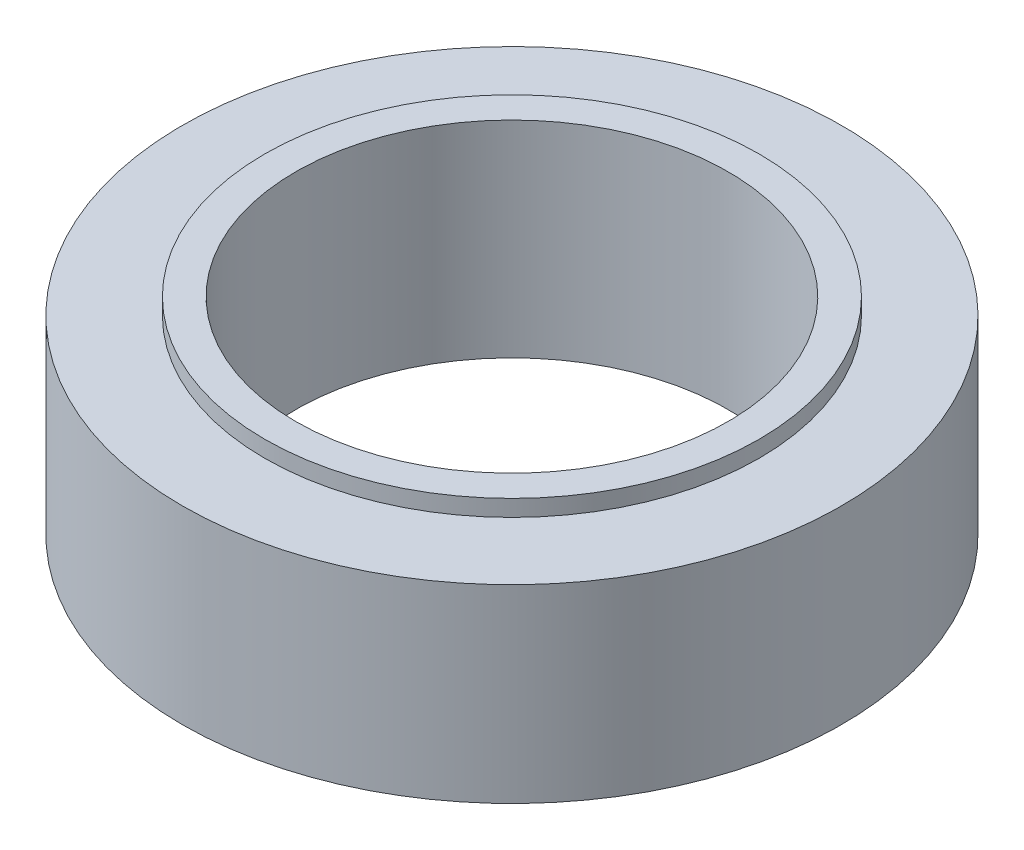
ISO-10303-21;
HEADER;
FILE_DESCRIPTION(('STEP AP214'),'2;1');
FILE_NAME('part.step','',(''),(''),'','','');
FILE_SCHEMA(('AUTOMOTIVE_DESIGN { 1 0 10303 214 1 1 1 1 }'));
ENDSEC;
DATA;
#1=APPLICATION_CONTEXT('core data for automotive mechanical design processes');
#2=APPLICATION_PROTOCOL_DEFINITION('international standard','automotive_design',2000,#1);
#3=PRODUCT_CONTEXT('',#1,'mechanical');
#4=PRODUCT('Part','Part','',(#3));
#5=PRODUCT_RELATED_PRODUCT_CATEGORY('part','',(#4));
#6=PRODUCT_DEFINITION_FORMATION('','',#4);
#7=PRODUCT_DEFINITION_CONTEXT('part definition',#1,'design');
#8=PRODUCT_DEFINITION('design','',#6,#7);
#9=PRODUCT_DEFINITION_SHAPE('','',#8);
#10=(LENGTH_UNIT() NAMED_UNIT(*) SI_UNIT(.MILLI.,.METRE.));
#11=(NAMED_UNIT(*) PLANE_ANGLE_UNIT() SI_UNIT($,.RADIAN.));
#12=(NAMED_UNIT(*) SI_UNIT($,.STERADIAN.) SOLID_ANGLE_UNIT());
#13=UNCERTAINTY_MEASURE_WITH_UNIT(LENGTH_MEASURE(1.E-05),#10,'distance_accuracy_value','');
#14=(GEOMETRIC_REPRESENTATION_CONTEXT(3) GLOBAL_UNCERTAINTY_ASSIGNED_CONTEXT((#13)) GLOBAL_UNIT_ASSIGNED_CONTEXT((#10,
#11,#12)) REPRESENTATION_CONTEXT('',''));
#15=CARTESIAN_POINT('',(0.,0.,0.));
#16=DIRECTION('',(0.,0.,1.));
#17=DIRECTION('',(1.,0.,0.));
#18=AXIS2_PLACEMENT_3D('',#15,#16,#17);
#19=CARTESIAN_POINT('',(0.,2.3,0.));
#20=DIRECTION('',(0.,1.,0.));
#21=DIRECTION('',(0.,0.,1.));
#22=AXIS2_PLACEMENT_3D('',#19,#20,#21);
#23=PLANE('',#22);
#24=CARTESIAN_POINT('',(0.,2.3,0.));
#25=DIRECTION('',(0.,1.,0.));
#26=DIRECTION('',(0.,0.,1.));
#27=AXIS2_PLACEMENT_3D('',#24,#25,#26);
#28=CIRCLE('',#27,4.);
#29=CARTESIAN_POINT('',(0.,2.3,4.));
#30=VERTEX_POINT('',#29);
#31=EDGE_CURVE('E10',#30,#30,#28,.T.);
#32=ORIENTED_EDGE('',*,*,#31,.T.);
#33=EDGE_LOOP('',(#32));
#34=FACE_BOUND('',#33,.T.);
#35=CARTESIAN_POINT('',(0.,2.3,0.));
#36=DIRECTION('',(0.,1.,0.));
#37=DIRECTION('',(0.,0.,1.));
#38=AXIS2_PLACEMENT_3D('',#35,#36,#37);
#39=CIRCLE('',#38,3.);
#40=CARTESIAN_POINT('',(0.,2.3,3.));
#41=VERTEX_POINT('',#40);
#42=EDGE_CURVE('E56',#41,#41,#39,.T.);
#43=ORIENTED_EDGE('',*,*,#42,.F.);
#44=EDGE_LOOP('',(#43));
#45=FACE_BOUND('',#44,.T.);
#46=ADVANCED_FACE('F37',(#34,#45),#23,.T.);
#47=CARTESIAN_POINT('',(0.,0.,0.));
#48=DIRECTION('',(0.,1.,0.));
#49=DIRECTION('',(0.,0.,1.));
#50=AXIS2_PLACEMENT_3D('',#47,#48,#49);
#51=PLANE('',#50);
#52=CARTESIAN_POINT('',(0.,0.,0.));
#53=DIRECTION('',(0.,1.,0.));
#54=DIRECTION('',(0.,0.,1.));
#55=AXIS2_PLACEMENT_3D('',#52,#53,#54);
#56=CIRCLE('',#55,4.);
#57=CARTESIAN_POINT('',(0.,0.,4.));
#58=VERTEX_POINT('',#57);
#59=EDGE_CURVE('E41',#58,#58,#56,.T.);
#60=ORIENTED_EDGE('',*,*,#59,.F.);
#61=EDGE_LOOP('',(#60));
#62=FACE_BOUND('',#61,.T.);
#63=CARTESIAN_POINT('',(0.,0.,0.));
#64=DIRECTION('',(0.,1.,0.));
#65=DIRECTION('',(0.,0.,1.));
#66=AXIS2_PLACEMENT_3D('',#63,#64,#65);
#67=CIRCLE('',#66,2.625);
#68=CARTESIAN_POINT('',(0.,0.,2.625));
#69=VERTEX_POINT('',#68);
#70=EDGE_CURVE('E50',#69,#69,#67,.T.);
#71=ORIENTED_EDGE('',*,*,#70,.T.);
#72=EDGE_LOOP('',(#71));
#73=FACE_BOUND('',#72,.T.);
#74=ADVANCED_FACE('F84',(#62,#73),#51,.F.);
#75=CARTESIAN_POINT('',(0.,2.3,0.));
#76=DIRECTION('',(0.,-1.,0.));
#77=DIRECTION('',(0.,0.,-1.));
#78=AXIS2_PLACEMENT_3D('',#75,#76,#77);
#79=CYLINDRICAL_SURFACE('',#78,4.);
#80=ORIENTED_EDGE('',*,*,#31,.F.);
#81=EDGE_LOOP('',(#80));
#82=FACE_BOUND('',#81,.T.);
#83=ORIENTED_EDGE('',*,*,#59,.T.);
#84=EDGE_LOOP('',(#83));
#85=FACE_BOUND('',#84,.T.);
#86=ADVANCED_FACE('F39',(#82,#85),#79,.T.);
#87=CARTESIAN_POINT('',(0.,2.3,0.));
#88=DIRECTION('',(0.,-1.,0.));
#89=DIRECTION('',(0.,0.,-1.));
#90=AXIS2_PLACEMENT_3D('',#87,#88,#89);
#91=CYLINDRICAL_SURFACE('',#90,2.625);
#92=ORIENTED_EDGE('',*,*,#70,.F.);
#93=EDGE_LOOP('',(#92));
#94=FACE_BOUND('',#93,.T.);
#95=CARTESIAN_POINT('',(0.,2.5,0.));
#96=DIRECTION('',(0.,1.,0.));
#97=DIRECTION('',(0.,0.,1.));
#98=AXIS2_PLACEMENT_3D('',#95,#96,#97);
#99=CIRCLE('',#98,2.625);
#100=CARTESIAN_POINT('',(0.,2.5,2.625));
#101=VERTEX_POINT('',#100);
#102=EDGE_CURVE('E60',#101,#101,#99,.T.);
#103=ORIENTED_EDGE('',*,*,#102,.T.);
#104=EDGE_LOOP('',(#103));
#105=FACE_BOUND('',#104,.T.);
#106=ADVANCED_FACE('F68',(#94,#105),#91,.F.);
#107=CARTESIAN_POINT('',(0.,2.5,0.));
#108=DIRECTION('',(0.,1.,0.));
#109=DIRECTION('',(0.,0.,1.));
#110=AXIS2_PLACEMENT_3D('',#107,#108,#109);
#111=PLANE('',#110);
#112=CARTESIAN_POINT('',(0.,2.5,0.));
#113=DIRECTION('',(0.,1.,0.));
#114=DIRECTION('',(0.,0.,1.));
#115=AXIS2_PLACEMENT_3D('',#112,#113,#114);
#116=CIRCLE('',#115,3.);
#117=CARTESIAN_POINT('',(0.,2.5,3.));
#118=VERTEX_POINT('',#117);
#119=EDGE_CURVE('E55',#118,#118,#116,.T.);
#120=ORIENTED_EDGE('',*,*,#119,.T.);
#121=EDGE_LOOP('',(#120));
#122=FACE_BOUND('',#121,.T.);
#123=ORIENTED_EDGE('',*,*,#102,.F.);
#124=EDGE_LOOP('',(#123));
#125=FACE_BOUND('',#124,.T.);
#126=ADVANCED_FACE('F70',(#122,#125),#111,.T.);
#127=CARTESIAN_POINT('',(0.,2.5,0.));
#128=DIRECTION('',(0.,-1.,0.));
#129=DIRECTION('',(0.,0.,-1.));
#130=AXIS2_PLACEMENT_3D('',#127,#128,#129);
#131=CYLINDRICAL_SURFACE('',#130,3.);
#132=ORIENTED_EDGE('',*,*,#119,.F.);
#133=EDGE_LOOP('',(#132));
#134=FACE_BOUND('',#133,.T.);
#135=ORIENTED_EDGE('',*,*,#42,.T.);
#136=EDGE_LOOP('',(#135));
#137=FACE_BOUND('',#136,.T.);
#138=ADVANCED_FACE('F72',(#134,#137),#131,.T.);
#139=CLOSED_SHELL('',(#46,#74,#86,#106,#126,#138));
#140=MANIFOLD_SOLID_BREP('B2',#139);
#141=ADVANCED_BREP_SHAPE_REPRESENTATION('',(#18,#140),#14);
#142=SHAPE_DEFINITION_REPRESENTATION(#9,#141);
ENDSEC;
END-ISO-10303-21;
